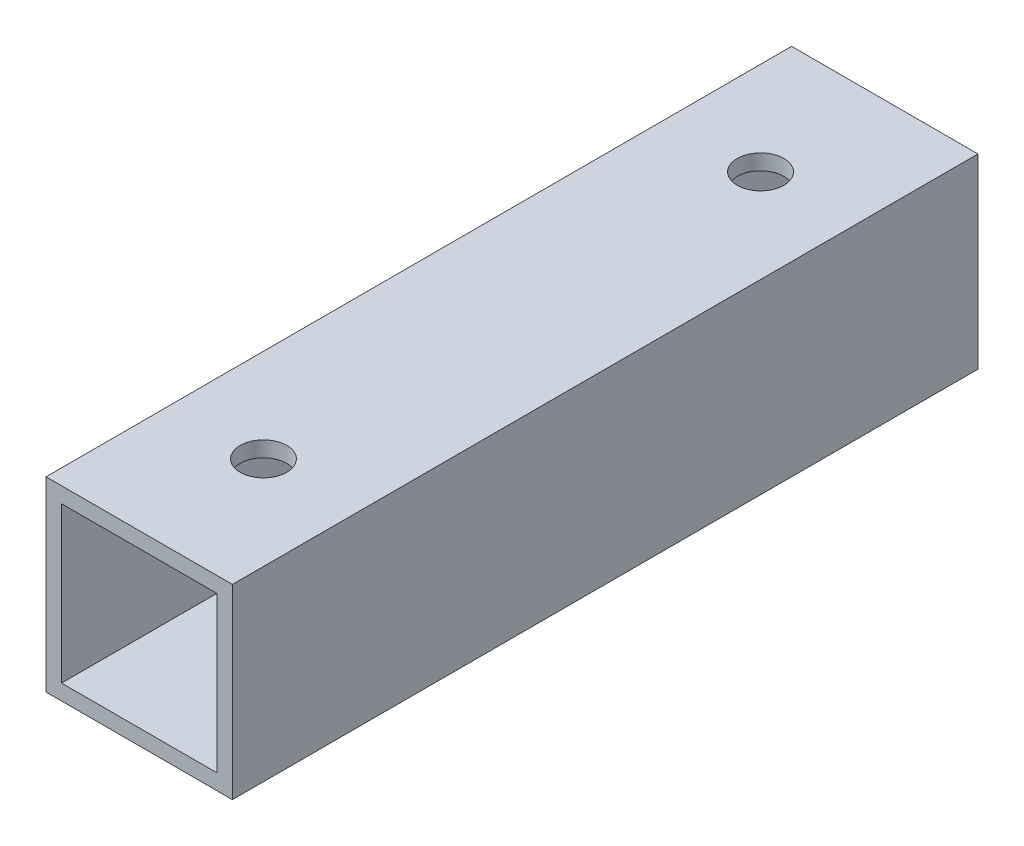
ISO-10303-21;
HEADER;
FILE_DESCRIPTION(('STEP AP214'),'2;1');
FILE_NAME('part.step','',(''),(''),'','','');
FILE_SCHEMA(('AUTOMOTIVE_DESIGN { 1 0 10303 214 1 1 1 1 }'));
ENDSEC;
DATA;
#1=APPLICATION_CONTEXT('core data for automotive mechanical design processes');
#2=APPLICATION_PROTOCOL_DEFINITION('international standard','automotive_design',2000,#1);
#3=PRODUCT_CONTEXT('',#1,'mechanical');
#4=PRODUCT('Part','Part','',(#3));
#5=PRODUCT_RELATED_PRODUCT_CATEGORY('part','',(#4));
#6=PRODUCT_DEFINITION_FORMATION('','',#4);
#7=PRODUCT_DEFINITION_CONTEXT('part definition',#1,'design');
#8=PRODUCT_DEFINITION('design','',#6,#7);
#9=PRODUCT_DEFINITION_SHAPE('','',#8);
#10=(LENGTH_UNIT() NAMED_UNIT(*) SI_UNIT(.MILLI.,.METRE.));
#11=(NAMED_UNIT(*) PLANE_ANGLE_UNIT() SI_UNIT($,.RADIAN.));
#12=(NAMED_UNIT(*) SI_UNIT($,.STERADIAN.) SOLID_ANGLE_UNIT());
#13=UNCERTAINTY_MEASURE_WITH_UNIT(LENGTH_MEASURE(1.E-05),#10,'distance_accuracy_value','');
#14=(GEOMETRIC_REPRESENTATION_CONTEXT(3) GLOBAL_UNCERTAINTY_ASSIGNED_CONTEXT((#13)) GLOBAL_UNIT_ASSIGNED_CONTEXT((#10,
#11,#12)) REPRESENTATION_CONTEXT('',''));
#15=CARTESIAN_POINT('',(0.,0.,0.));
#16=DIRECTION('',(0.,0.,1.));
#17=DIRECTION('',(1.,0.,0.));
#18=AXIS2_PLACEMENT_3D('',#15,#16,#17);
#19=CARTESIAN_POINT('',(0.,0.,76.2));
#20=DIRECTION('',(0.,0.,-1.));
#21=DIRECTION('',(-1.,0.,0.));
#22=AXIS2_PLACEMENT_3D('',#19,#20,#21);
#23=PLANE('',#22);
#24=DIRECTION('',(0.,1.,0.));
#25=VECTOR('',#24,1.);
#26=CARTESIAN_POINT('',(9.525,-9.525,76.2));
#27=LINE('',#26,#25);
#28=CARTESIAN_POINT('',(9.525,-9.525,76.2));
#29=VERTEX_POINT('',#28);
#30=CARTESIAN_POINT('',(9.525,9.525,76.2));
#31=VERTEX_POINT('',#30);
#32=EDGE_CURVE('E138',#29,#31,#27,.T.);
#33=ORIENTED_EDGE('',*,*,#32,.T.);
#34=DIRECTION('',(-1.,0.,0.));
#35=VECTOR('',#34,1.);
#36=CARTESIAN_POINT('',(-9.525,9.525,76.2));
#37=LINE('',#36,#35);
#38=CARTESIAN_POINT('',(-9.525,9.525,76.2));
#39=VERTEX_POINT('',#38);
#40=EDGE_CURVE('E141',#31,#39,#37,.T.);
#41=ORIENTED_EDGE('',*,*,#40,.T.);
#42=DIRECTION('',(0.,-1.,0.));
#43=VECTOR('',#42,1.);
#44=CARTESIAN_POINT('',(-9.525,-9.525,76.2));
#45=LINE('',#44,#43);
#46=CARTESIAN_POINT('',(-9.525,-9.525,76.2));
#47=VERTEX_POINT('',#46);
#48=EDGE_CURVE('E144',#39,#47,#45,.T.);
#49=ORIENTED_EDGE('',*,*,#48,.T.);
#50=DIRECTION('',(1.,0.,0.));
#51=VECTOR('',#50,1.);
#52=CARTESIAN_POINT('',(-9.525,-9.525,76.2));
#53=LINE('',#52,#51);
#54=EDGE_CURVE('E146',#47,#29,#53,.T.);
#55=ORIENTED_EDGE('',*,*,#54,.T.);
#56=EDGE_LOOP('',(#33,#41,#49,#55));
#57=FACE_BOUND('',#56,.T.);
#58=DIRECTION('',(0.,1.,0.));
#59=VECTOR('',#58,1.);
#60=CARTESIAN_POINT('',(7.9375,-7.9375,76.2));
#61=LINE('',#60,#59);
#62=CARTESIAN_POINT('',(7.9375,-7.9375,76.2));
#63=VERTEX_POINT('',#62);
#64=CARTESIAN_POINT('',(7.9375,7.9375,76.2));
#65=VERTEX_POINT('',#64);
#66=EDGE_CURVE('E100',#63,#65,#61,.T.);
#67=ORIENTED_EDGE('',*,*,#66,.F.);
#68=DIRECTION('',(1.,0.,0.));
#69=VECTOR('',#68,1.);
#70=CARTESIAN_POINT('',(-7.9375,-7.9375,76.2));
#71=LINE('',#70,#69);
#72=CARTESIAN_POINT('',(-7.9375,-7.9375,76.2));
#73=VERTEX_POINT('',#72);
#74=EDGE_CURVE('E122',#73,#63,#71,.T.);
#75=ORIENTED_EDGE('',*,*,#74,.F.);
#76=DIRECTION('',(0.,-1.,0.));
#77=VECTOR('',#76,1.);
#78=CARTESIAN_POINT('',(-7.9375,-7.9375,76.2));
#79=LINE('',#78,#77);
#80=CARTESIAN_POINT('',(-7.9375,7.9375,76.2));
#81=VERTEX_POINT('',#80);
#82=EDGE_CURVE('E120',#81,#73,#79,.T.);
#83=ORIENTED_EDGE('',*,*,#82,.F.);
#84=DIRECTION('',(-1.,0.,0.));
#85=VECTOR('',#84,1.);
#86=CARTESIAN_POINT('',(-7.9375,7.9375,76.2));
#87=LINE('',#86,#85);
#88=EDGE_CURVE('E108',#65,#81,#87,.T.);
#89=ORIENTED_EDGE('',*,*,#88,.F.);
#90=EDGE_LOOP('',(#67,#75,#83,#89));
#91=FACE_BOUND('',#90,.T.);
#92=ADVANCED_FACE('F33',(#57,#91),#23,.F.);
#93=CARTESIAN_POINT('',(0.,0.,0.));
#94=DIRECTION('',(0.,0.,-1.));
#95=DIRECTION('',(-1.,0.,0.));
#96=AXIS2_PLACEMENT_3D('',#93,#94,#95);
#97=PLANE('',#96);
#98=DIRECTION('',(0.,1.,0.));
#99=VECTOR('',#98,1.);
#100=CARTESIAN_POINT('',(9.525,-9.525,0.));
#101=LINE('',#100,#99);
#102=CARTESIAN_POINT('',(9.525,-9.525,0.));
#103=VERTEX_POINT('',#102);
#104=CARTESIAN_POINT('',(9.525,9.525,0.));
#105=VERTEX_POINT('',#104);
#106=EDGE_CURVE('E116',#103,#105,#101,.T.);
#107=ORIENTED_EDGE('',*,*,#106,.F.);
#108=DIRECTION('',(1.,0.,0.));
#109=VECTOR('',#108,1.);
#110=CARTESIAN_POINT('',(-9.525,-9.525,0.));
#111=LINE('',#110,#109);
#112=CARTESIAN_POINT('',(-9.525,-9.525,0.));
#113=VERTEX_POINT('',#112);
#114=EDGE_CURVE('E142',#113,#103,#111,.T.);
#115=ORIENTED_EDGE('',*,*,#114,.F.);
#116=DIRECTION('',(0.,-1.,0.));
#117=VECTOR('',#116,1.);
#118=CARTESIAN_POINT('',(-9.525,-9.525,0.));
#119=LINE('',#118,#117);
#120=CARTESIAN_POINT('',(-9.525,9.525,0.));
#121=VERTEX_POINT('',#120);
#122=EDGE_CURVE('E153',#121,#113,#119,.T.);
#123=ORIENTED_EDGE('',*,*,#122,.F.);
#124=DIRECTION('',(-1.,0.,0.));
#125=VECTOR('',#124,1.);
#126=CARTESIAN_POINT('',(-9.525,9.525,0.));
#127=LINE('',#126,#125);
#128=EDGE_CURVE('E151',#105,#121,#127,.T.);
#129=ORIENTED_EDGE('',*,*,#128,.F.);
#130=EDGE_LOOP('',(#107,#115,#123,#129));
#131=FACE_BOUND('',#130,.T.);
#132=DIRECTION('',(1.,0.,0.));
#133=VECTOR('',#132,1.);
#134=CARTESIAN_POINT('',(-7.9375,-7.9375,0.));
#135=LINE('',#134,#133);
#136=CARTESIAN_POINT('',(-7.9375,-7.9375,0.));
#137=VERTEX_POINT('',#136);
#138=CARTESIAN_POINT('',(7.9375,-7.9375,0.));
#139=VERTEX_POINT('',#138);
#140=EDGE_CURVE('E109',#137,#139,#135,.T.);
#141=ORIENTED_EDGE('',*,*,#140,.T.);
#142=DIRECTION('',(0.,1.,0.));
#143=VECTOR('',#142,1.);
#144=CARTESIAN_POINT('',(7.9375,-7.9375,0.));
#145=LINE('',#144,#143);
#146=CARTESIAN_POINT('',(7.9375,7.9375,0.));
#147=VERTEX_POINT('',#146);
#148=EDGE_CURVE('E58',#139,#147,#145,.T.);
#149=ORIENTED_EDGE('',*,*,#148,.T.);
#150=DIRECTION('',(-1.,0.,0.));
#151=VECTOR('',#150,1.);
#152=CARTESIAN_POINT('',(-7.9375,7.9375,0.));
#153=LINE('',#152,#151);
#154=CARTESIAN_POINT('',(-7.9375,7.9375,0.));
#155=VERTEX_POINT('',#154);
#156=EDGE_CURVE('E115',#147,#155,#153,.T.);
#157=ORIENTED_EDGE('',*,*,#156,.T.);
#158=DIRECTION('',(0.,-1.,0.));
#159=VECTOR('',#158,1.);
#160=CARTESIAN_POINT('',(-7.9375,-7.9375,0.));
#161=LINE('',#160,#159);
#162=EDGE_CURVE('E130',#155,#137,#161,.T.);
#163=ORIENTED_EDGE('',*,*,#162,.T.);
#164=EDGE_LOOP('',(#141,#149,#157,#163));
#165=FACE_BOUND('',#164,.T.);
#166=ADVANCED_FACE('F202',(#131,#165),#97,.T.);
#167=CARTESIAN_POINT('',(9.525,-9.525,76.2));
#168=DIRECTION('',(-1.,0.,0.));
#169=DIRECTION('',(0.,0.,1.));
#170=AXIS2_PLACEMENT_3D('',#167,#168,#169);
#171=PLANE('',#170);
#172=ORIENTED_EDGE('',*,*,#106,.T.);
#173=DIRECTION('',(0.,0.,-1.));
#174=VECTOR('',#173,1.);
#175=CARTESIAN_POINT('',(9.525,9.525,76.2));
#176=LINE('',#175,#174);
#177=EDGE_CURVE('E11',#31,#105,#176,.T.);
#178=ORIENTED_EDGE('',*,*,#177,.F.);
#179=ORIENTED_EDGE('',*,*,#32,.F.);
#180=DIRECTION('',(0.,0.,-1.));
#181=VECTOR('',#180,1.);
#182=CARTESIAN_POINT('',(9.525,-9.525,76.2));
#183=LINE('',#182,#181);
#184=EDGE_CURVE('E148',#29,#103,#183,.T.);
#185=ORIENTED_EDGE('',*,*,#184,.T.);
#186=EDGE_LOOP('',(#172,#178,#179,#185));
#187=FACE_BOUND('',#186,.T.);
#188=ADVANCED_FACE('F35',(#187),#171,.F.);
#189=CARTESIAN_POINT('',(-9.525,9.525,76.2));
#190=DIRECTION('',(0.,-1.,0.));
#191=DIRECTION('',(0.,0.,-1.));
#192=AXIS2_PLACEMENT_3D('',#189,#190,#191);
#193=PLANE('',#192);
#194=CARTESIAN_POINT('',(0.,9.525,12.7));
#195=DIRECTION('',(0.,1.,0.));
#196=DIRECTION('',(0.,0.,1.));
#197=AXIS2_PLACEMENT_3D('',#194,#195,#196);
#198=CIRCLE('',#197,2.38125);
#199=CARTESIAN_POINT('',(0.,9.525,15.08125));
#200=VERTEX_POINT('',#199);
#201=EDGE_CURVE('E171',#200,#200,#198,.T.);
#202=ORIENTED_EDGE('',*,*,#201,.F.);
#203=EDGE_LOOP('',(#202));
#204=FACE_BOUND('',#203,.T.);
#205=CARTESIAN_POINT('',(0.,9.525,63.5));
#206=DIRECTION('',(0.,1.,0.));
#207=DIRECTION('',(0.,0.,1.));
#208=AXIS2_PLACEMENT_3D('',#205,#206,#207);
#209=CIRCLE('',#208,2.38125);
#210=CARTESIAN_POINT('',(0.,9.525,65.88125));
#211=VERTEX_POINT('',#210);
#212=EDGE_CURVE('E180',#211,#211,#209,.T.);
#213=ORIENTED_EDGE('',*,*,#212,.F.);
#214=EDGE_LOOP('',(#213));
#215=FACE_BOUND('',#214,.T.);
#216=ORIENTED_EDGE('',*,*,#128,.T.);
#217=DIRECTION('',(0.,0.,-1.));
#218=VECTOR('',#217,1.);
#219=CARTESIAN_POINT('',(-9.525,9.525,76.2));
#220=LINE('',#219,#218);
#221=EDGE_CURVE('E42',#39,#121,#220,.T.);
#222=ORIENTED_EDGE('',*,*,#221,.F.);
#223=ORIENTED_EDGE('',*,*,#40,.F.);
#224=ORIENTED_EDGE('',*,*,#177,.T.);
#225=EDGE_LOOP('',(#216,#222,#223,#224));
#226=FACE_BOUND('',#225,.T.);
#227=ADVANCED_FACE('F228',(#204,#215,#226),#193,.F.);
#228=CARTESIAN_POINT('',(-9.525,-9.525,76.2));
#229=DIRECTION('',(1.,0.,0.));
#230=DIRECTION('',(0.,0.,-1.));
#231=AXIS2_PLACEMENT_3D('',#228,#229,#230);
#232=PLANE('',#231);
#233=CARTESIAN_POINT('',(-9.525,0.,38.1));
#234=DIRECTION('',(-1.,0.,0.));
#235=DIRECTION('',(0.,0.,1.));
#236=AXIS2_PLACEMENT_3D('',#233,#234,#235);
#237=CIRCLE('',#236,3.96875);
#238=CARTESIAN_POINT('',(-9.525,0.,42.06875));
#239=VERTEX_POINT('',#238);
#240=EDGE_CURVE('E183',#239,#239,#237,.T.);
#241=ORIENTED_EDGE('',*,*,#240,.F.);
#242=EDGE_LOOP('',(#241));
#243=FACE_BOUND('',#242,.T.);
#244=ORIENTED_EDGE('',*,*,#122,.T.);
#245=DIRECTION('',(0.,0.,-1.));
#246=VECTOR('',#245,1.);
#247=CARTESIAN_POINT('',(-9.525,-9.525,76.2));
#248=LINE('',#247,#246);
#249=EDGE_CURVE('E158',#47,#113,#248,.T.);
#250=ORIENTED_EDGE('',*,*,#249,.F.);
#251=ORIENTED_EDGE('',*,*,#48,.F.);
#252=ORIENTED_EDGE('',*,*,#221,.T.);
#253=EDGE_LOOP('',(#244,#250,#251,#252));
#254=FACE_BOUND('',#253,.T.);
#255=ADVANCED_FACE('F226',(#243,#254),#232,.F.);
#256=CARTESIAN_POINT('',(-9.525,-9.525,76.2));
#257=DIRECTION('',(0.,1.,0.));
#258=DIRECTION('',(0.,0.,1.));
#259=AXIS2_PLACEMENT_3D('',#256,#257,#258);
#260=PLANE('',#259);
#261=CARTESIAN_POINT('',(0.,-9.525,12.7));
#262=DIRECTION('',(0.,1.,0.));
#263=DIRECTION('',(0.,0.,1.));
#264=AXIS2_PLACEMENT_3D('',#261,#262,#263);
#265=CIRCLE('',#264,2.38125);
#266=CARTESIAN_POINT('',(0.,-9.525,15.08125));
#267=VERTEX_POINT('',#266);
#268=EDGE_CURVE('E165',#267,#267,#265,.T.);
#269=ORIENTED_EDGE('',*,*,#268,.T.);
#270=EDGE_LOOP('',(#269));
#271=FACE_BOUND('',#270,.T.);
#272=CARTESIAN_POINT('',(0.,-9.525,63.5));
#273=DIRECTION('',(0.,1.,0.));
#274=DIRECTION('',(0.,0.,1.));
#275=AXIS2_PLACEMENT_3D('',#272,#273,#274);
#276=CIRCLE('',#275,2.38125);
#277=CARTESIAN_POINT('',(0.,-9.525,65.88125));
#278=VERTEX_POINT('',#277);
#279=EDGE_CURVE('E176',#278,#278,#276,.T.);
#280=ORIENTED_EDGE('',*,*,#279,.T.);
#281=EDGE_LOOP('',(#280));
#282=FACE_BOUND('',#281,.T.);
#283=ORIENTED_EDGE('',*,*,#114,.T.);
#284=ORIENTED_EDGE('',*,*,#184,.F.);
#285=ORIENTED_EDGE('',*,*,#54,.F.);
#286=ORIENTED_EDGE('',*,*,#249,.T.);
#287=EDGE_LOOP('',(#283,#284,#285,#286));
#288=FACE_BOUND('',#287,.T.);
#289=ADVANCED_FACE('F223',(#271,#282,#288),#260,.F.);
#290=CARTESIAN_POINT('',(7.9375,-7.9375,76.2));
#291=DIRECTION('',(-1.,0.,0.));
#292=DIRECTION('',(0.,0.,1.));
#293=AXIS2_PLACEMENT_3D('',#290,#291,#292);
#294=PLANE('',#293);
#295=ORIENTED_EDGE('',*,*,#148,.F.);
#296=DIRECTION('',(0.,0.,-1.));
#297=VECTOR('',#296,1.);
#298=CARTESIAN_POINT('',(7.9375,-7.9375,76.2));
#299=LINE('',#298,#297);
#300=EDGE_CURVE('E104',#63,#139,#299,.T.);
#301=ORIENTED_EDGE('',*,*,#300,.F.);
#302=ORIENTED_EDGE('',*,*,#66,.T.);
#303=DIRECTION('',(0.,0.,-1.));
#304=VECTOR('',#303,1.);
#305=CARTESIAN_POINT('',(7.9375,7.9375,76.2));
#306=LINE('',#305,#304);
#307=EDGE_CURVE('E103',#65,#147,#306,.T.);
#308=ORIENTED_EDGE('',*,*,#307,.T.);
#309=EDGE_LOOP('',(#295,#301,#302,#308));
#310=FACE_BOUND('',#309,.T.);
#311=ADVANCED_FACE('F102',(#310),#294,.T.);
#312=CARTESIAN_POINT('',(-7.9375,7.9375,76.2));
#313=DIRECTION('',(0.,-1.,0.));
#314=DIRECTION('',(0.,0.,-1.));
#315=AXIS2_PLACEMENT_3D('',#312,#313,#314);
#316=PLANE('',#315);
#317=CARTESIAN_POINT('',(0.,7.93749999999999,12.7));
#318=DIRECTION('',(0.,-1.,0.));
#319=DIRECTION('',(0.,0.,-1.));
#320=AXIS2_PLACEMENT_3D('',#317,#318,#319);
#321=CIRCLE('',#320,2.38125);
#322=CARTESIAN_POINT('',(0.,7.93749999999999,15.08125));
#323=VERTEX_POINT('',#322);
#324=EDGE_CURVE('E128',#323,#323,#321,.T.);
#325=ORIENTED_EDGE('',*,*,#324,.F.);
#326=EDGE_LOOP('',(#325));
#327=FACE_BOUND('',#326,.T.);
#328=CARTESIAN_POINT('',(0.,7.93749999999999,63.5));
#329=DIRECTION('',(0.,-1.,0.));
#330=DIRECTION('',(0.,0.,-1.));
#331=AXIS2_PLACEMENT_3D('',#328,#329,#330);
#332=CIRCLE('',#331,2.38125);
#333=CARTESIAN_POINT('',(0.,7.93749999999999,65.88125));
#334=VERTEX_POINT('',#333);
#335=EDGE_CURVE('E164',#334,#334,#332,.T.);
#336=ORIENTED_EDGE('',*,*,#335,.F.);
#337=EDGE_LOOP('',(#336));
#338=FACE_BOUND('',#337,.T.);
#339=ORIENTED_EDGE('',*,*,#156,.F.);
#340=ORIENTED_EDGE('',*,*,#307,.F.);
#341=ORIENTED_EDGE('',*,*,#88,.T.);
#342=DIRECTION('',(0.,0.,-1.));
#343=VECTOR('',#342,1.);
#344=CARTESIAN_POINT('',(-7.9375,7.9375,76.2));
#345=LINE('',#344,#343);
#346=EDGE_CURVE('E117',#81,#155,#345,.T.);
#347=ORIENTED_EDGE('',*,*,#346,.T.);
#348=EDGE_LOOP('',(#339,#340,#341,#347));
#349=FACE_BOUND('',#348,.T.);
#350=ADVANCED_FACE('F112',(#327,#338,#349),#316,.T.);
#351=CARTESIAN_POINT('',(-7.9375,-7.9375,76.2));
#352=DIRECTION('',(1.,0.,0.));
#353=DIRECTION('',(0.,0.,-1.));
#354=AXIS2_PLACEMENT_3D('',#351,#352,#353);
#355=PLANE('',#354);
#356=CARTESIAN_POINT('',(-7.9375,0.,38.1));
#357=DIRECTION('',(1.,0.,0.));
#358=DIRECTION('',(0.,0.,-1.));
#359=AXIS2_PLACEMENT_3D('',#356,#357,#358);
#360=CIRCLE('',#359,3.96875);
#361=CARTESIAN_POINT('',(-7.9375,0.,34.13125));
#362=VERTEX_POINT('',#361);
#363=EDGE_CURVE('E315',#362,#362,#360,.F.);
#364=ORIENTED_EDGE('',*,*,#363,.T.);
#365=EDGE_LOOP('',(#364));
#366=FACE_BOUND('',#365,.T.);
#367=ORIENTED_EDGE('',*,*,#162,.F.);
#368=ORIENTED_EDGE('',*,*,#346,.F.);
#369=ORIENTED_EDGE('',*,*,#82,.T.);
#370=DIRECTION('',(0.,0.,-1.));
#371=VECTOR('',#370,1.);
#372=CARTESIAN_POINT('',(-7.9375,-7.9375,76.2));
#373=LINE('',#372,#371);
#374=EDGE_CURVE('E50',#73,#137,#373,.T.);
#375=ORIENTED_EDGE('',*,*,#374,.T.);
#376=EDGE_LOOP('',(#367,#368,#369,#375));
#377=FACE_BOUND('',#376,.T.);
#378=ADVANCED_FACE('F198',(#366,#377),#355,.T.);
#379=CARTESIAN_POINT('',(-7.9375,-7.9375,76.2));
#380=DIRECTION('',(0.,1.,0.));
#381=DIRECTION('',(0.,0.,1.));
#382=AXIS2_PLACEMENT_3D('',#379,#380,#381);
#383=PLANE('',#382);
#384=CARTESIAN_POINT('',(0.,-7.9375,12.7));
#385=DIRECTION('',(0.,1.,0.));
#386=DIRECTION('',(0.,0.,1.));
#387=AXIS2_PLACEMENT_3D('',#384,#385,#386);
#388=CIRCLE('',#387,2.38125);
#389=CARTESIAN_POINT('',(0.,-7.9375,15.08125));
#390=VERTEX_POINT('',#389);
#391=EDGE_CURVE('E37',#390,#390,#388,.T.);
#392=ORIENTED_EDGE('',*,*,#391,.F.);
#393=EDGE_LOOP('',(#392));
#394=FACE_BOUND('',#393,.T.);
#395=CARTESIAN_POINT('',(0.,-7.9375,63.5));
#396=DIRECTION('',(0.,1.,0.));
#397=DIRECTION('',(0.,0.,1.));
#398=AXIS2_PLACEMENT_3D('',#395,#396,#397);
#399=CIRCLE('',#398,2.38125);
#400=CARTESIAN_POINT('',(0.,-7.9375,65.88125));
#401=VERTEX_POINT('',#400);
#402=EDGE_CURVE('E162',#401,#401,#399,.T.);
#403=ORIENTED_EDGE('',*,*,#402,.F.);
#404=EDGE_LOOP('',(#403));
#405=FACE_BOUND('',#404,.T.);
#406=ORIENTED_EDGE('',*,*,#140,.F.);
#407=ORIENTED_EDGE('',*,*,#374,.F.);
#408=ORIENTED_EDGE('',*,*,#74,.T.);
#409=ORIENTED_EDGE('',*,*,#300,.T.);
#410=EDGE_LOOP('',(#406,#407,#408,#409));
#411=FACE_BOUND('',#410,.T.);
#412=ADVANCED_FACE('F194',(#394,#405,#411),#383,.T.);
#413=CARTESIAN_POINT('',(0.,-9.525,63.5));
#414=DIRECTION('',(0.,1.,0.));
#415=DIRECTION('',(0.,0.,1.));
#416=AXIS2_PLACEMENT_3D('',#413,#414,#415);
#417=CYLINDRICAL_SURFACE('',#416,2.38125);
#418=CARTESIAN_POINT('',(0.,-7.9375,65.88125));
#419=CARTESIAN_POINT('',(0.,-7.95403645833333,65.88125));
#420=CARTESIAN_POINT('',(0.,-7.97057291666667,65.88125));
#421=CARTESIAN_POINT('',(0.,-8.00364583333333,65.88125));
#422=CARTESIAN_POINT('',(0.,-8.02018229166667,65.88125));
#423=CARTESIAN_POINT('',(0.,-8.05325520833333,65.88125));
#424=CARTESIAN_POINT('',(0.,-8.06979166666667,65.88125));
#425=CARTESIAN_POINT('',(0.,-8.10286458333333,65.88125));
#426=CARTESIAN_POINT('',(0.,-8.11940104166667,65.88125));
#427=CARTESIAN_POINT('',(0.,-8.15247395833333,65.88125));
#428=CARTESIAN_POINT('',(0.,-8.16901041666667,65.88125));
#429=CARTESIAN_POINT('',(0.,-8.20208333333333,65.88125));
#430=CARTESIAN_POINT('',(0.,-8.21861979166667,65.88125));
#431=CARTESIAN_POINT('',(0.,-8.25169270833333,65.88125));
#432=CARTESIAN_POINT('',(0.,-8.26822916666667,65.88125));
#433=CARTESIAN_POINT('',(0.,-8.30130208333333,65.88125));
#434=CARTESIAN_POINT('',(0.,-8.31783854166667,65.88125));
#435=CARTESIAN_POINT('',(0.,-8.35091145833333,65.88125));
#436=CARTESIAN_POINT('',(0.,-8.36744791666667,65.88125));
#437=CARTESIAN_POINT('',(0.,-8.40052083333333,65.88125));
#438=CARTESIAN_POINT('',(0.,-8.41705729166667,65.88125));
#439=CARTESIAN_POINT('',(0.,-8.45013020833333,65.88125));
#440=CARTESIAN_POINT('',(0.,-8.46666666666667,65.88125));
#441=CARTESIAN_POINT('',(0.,-8.49973958333333,65.88125));
#442=CARTESIAN_POINT('',(0.,-8.51627604166667,65.88125));
#443=CARTESIAN_POINT('',(0.,-8.54934895833333,65.88125));
#444=CARTESIAN_POINT('',(0.,-8.56588541666667,65.88125));
#445=CARTESIAN_POINT('',(0.,-8.59895833333333,65.88125));
#446=CARTESIAN_POINT('',(0.,-8.61549479166667,65.88125));
#447=CARTESIAN_POINT('',(0.,-8.64856770833333,65.88125));
#448=CARTESIAN_POINT('',(0.,-8.66510416666667,65.88125));
#449=CARTESIAN_POINT('',(0.,-8.69817708333333,65.88125));
#450=CARTESIAN_POINT('',(0.,-8.71471354166667,65.88125));
#451=CARTESIAN_POINT('',(0.,-8.74778645833333,65.88125));
#452=CARTESIAN_POINT('',(0.,-8.76432291666667,65.88125));
#453=CARTESIAN_POINT('',(0.,-8.79739583333333,65.88125));
#454=CARTESIAN_POINT('',(0.,-8.81393229166667,65.88125));
#455=CARTESIAN_POINT('',(0.,-8.84700520833333,65.88125));
#456=CARTESIAN_POINT('',(0.,-8.86354166666667,65.88125));
#457=CARTESIAN_POINT('',(0.,-8.89661458333333,65.88125));
#458=CARTESIAN_POINT('',(0.,-8.91315104166667,65.88125));
#459=CARTESIAN_POINT('',(0.,-8.94622395833333,65.88125));
#460=CARTESIAN_POINT('',(0.,-8.96276041666667,65.88125));
#461=CARTESIAN_POINT('',(0.,-8.99583333333334,65.88125));
#462=CARTESIAN_POINT('',(0.,-9.01236979166667,65.88125));
#463=CARTESIAN_POINT('',(0.,-9.04544270833333,65.88125));
#464=CARTESIAN_POINT('',(0.,-9.06197916666667,65.88125));
#465=CARTESIAN_POINT('',(0.,-9.09505208333333,65.88125));
#466=CARTESIAN_POINT('',(0.,-9.11158854166667,65.88125));
#467=CARTESIAN_POINT('',(0.,-9.14466145833333,65.88125));
#468=CARTESIAN_POINT('',(0.,-9.16119791666667,65.88125));
#469=CARTESIAN_POINT('',(0.,-9.19427083333333,65.88125));
#470=CARTESIAN_POINT('',(0.,-9.21080729166667,65.88125));
#471=CARTESIAN_POINT('',(0.,-9.24388020833333,65.88125));
#472=CARTESIAN_POINT('',(0.,-9.26041666666667,65.88125));
#473=CARTESIAN_POINT('',(0.,-9.29348958333333,65.88125));
#474=CARTESIAN_POINT('',(0.,-9.31002604166667,65.88125));
#475=CARTESIAN_POINT('',(0.,-9.34309895833333,65.88125));
#476=CARTESIAN_POINT('',(0.,-9.35963541666667,65.88125));
#477=CARTESIAN_POINT('',(0.,-9.39270833333333,65.88125));
#478=CARTESIAN_POINT('',(0.,-9.40924479166667,65.88125));
#479=CARTESIAN_POINT('',(0.,-9.44231770833333,65.88125));
#480=CARTESIAN_POINT('',(0.,-9.45885416666667,65.88125));
#481=CARTESIAN_POINT('',(0.,-9.49192708333333,65.88125));
#482=CARTESIAN_POINT('',(0.,-9.50846354166667,65.88125));
#483=CARTESIAN_POINT('',(0.,-9.525,65.88125));
#484=B_SPLINE_CURVE_WITH_KNOTS('',3,(#418,#419,#420,#421,#422,#423,#424,#425,#426,#427,#428,
#429,#430,#431,#432,#433,#434,#435,#436,#437,#438,#439,#440,#441,#442,#443,#444,#445,#446,#447,
#448,#449,#450,#451,#452,#453,#454,#455,#456,#457,#458,#459,#460,#461,#462,#463,#464,#465,#466,
#467,#468,#469,#470,#471,#472,#473,#474,#475,#476,#477,#478,#479,#480,#481,#482,#483),
.UNSPECIFIED.,.F.,.F.,(4,2,2,2,2,2,2,2,2,2,2,2,2,2,2,2,2,2,2,2,2,2,2,2,2,2,2,2,2,2,2,2,4),(0.,
0.0496093750000006,0.0992187500000012,0.148828125000002,0.198437500000001,0.248046875000001,
0.297656250000002,0.347265625000001,0.396875000000001,0.446484375000002,0.496093750000001,
0.545703125000002,0.595312500000002,0.644921875000001,0.694531250000002,0.744140625000002,
0.793750000000001,0.843359375000002,0.892968750000002,0.942578125000001,0.992187500000002,
1.041796875,1.09140625,1.141015625,1.190625,1.240234375,1.28984375,1.339453125,1.3890625,
1.438671875,1.48828125,1.537890625,1.5875),.UNSPECIFIED.);
#485=EDGE_CURVE('BSEAM197',#401,#278,#484,.T.);
#486=ORIENTED_EDGE('',*,*,#402,.T.);
#487=ORIENTED_EDGE('',*,*,#279,.F.);
#488=ORIENTED_EDGE('',*,*,#485,.T.);
#489=ORIENTED_EDGE('',*,*,#485,.F.);
#490=EDGE_LOOP('',(#486,#488,#487,#489));
#491=FACE_BOUND('',#490,.T.);
#492=ADVANCED_FACE('F197',(#491),#417,.F.);
#493=CARTESIAN_POINT('',(0.,-9.525,12.7));
#494=DIRECTION('',(0.,1.,0.));
#495=DIRECTION('',(0.,0.,1.));
#496=AXIS2_PLACEMENT_3D('',#493,#494,#495);
#497=CYLINDRICAL_SURFACE('',#496,2.38125);
#498=CARTESIAN_POINT('',(0.,-7.9375,15.08125));
#499=CARTESIAN_POINT('',(0.,-7.95403645833333,15.08125));
#500=CARTESIAN_POINT('',(0.,-7.97057291666667,15.08125));
#501=CARTESIAN_POINT('',(0.,-8.00364583333333,15.08125));
#502=CARTESIAN_POINT('',(0.,-8.02018229166667,15.08125));
#503=CARTESIAN_POINT('',(0.,-8.05325520833333,15.08125));
#504=CARTESIAN_POINT('',(0.,-8.06979166666667,15.08125));
#505=CARTESIAN_POINT('',(0.,-8.10286458333333,15.08125));
#506=CARTESIAN_POINT('',(0.,-8.11940104166667,15.08125));
#507=CARTESIAN_POINT('',(0.,-8.15247395833333,15.08125));
#508=CARTESIAN_POINT('',(0.,-8.16901041666667,15.08125));
#509=CARTESIAN_POINT('',(0.,-8.20208333333333,15.08125));
#510=CARTESIAN_POINT('',(0.,-8.21861979166667,15.08125));
#511=CARTESIAN_POINT('',(0.,-8.25169270833333,15.08125));
#512=CARTESIAN_POINT('',(0.,-8.26822916666667,15.08125));
#513=CARTESIAN_POINT('',(0.,-8.30130208333333,15.08125));
#514=CARTESIAN_POINT('',(0.,-8.31783854166667,15.08125));
#515=CARTESIAN_POINT('',(0.,-8.35091145833333,15.08125));
#516=CARTESIAN_POINT('',(0.,-8.36744791666667,15.08125));
#517=CARTESIAN_POINT('',(0.,-8.40052083333333,15.08125));
#518=CARTESIAN_POINT('',(0.,-8.41705729166667,15.08125));
#519=CARTESIAN_POINT('',(0.,-8.45013020833333,15.08125));
#520=CARTESIAN_POINT('',(0.,-8.46666666666667,15.08125));
#521=CARTESIAN_POINT('',(0.,-8.49973958333333,15.08125));
#522=CARTESIAN_POINT('',(0.,-8.51627604166667,15.08125));
#523=CARTESIAN_POINT('',(0.,-8.54934895833333,15.08125));
#524=CARTESIAN_POINT('',(0.,-8.56588541666667,15.08125));
#525=CARTESIAN_POINT('',(0.,-8.59895833333333,15.08125));
#526=CARTESIAN_POINT('',(0.,-8.61549479166667,15.08125));
#527=CARTESIAN_POINT('',(0.,-8.64856770833333,15.08125));
#528=CARTESIAN_POINT('',(0.,-8.66510416666667,15.08125));
#529=CARTESIAN_POINT('',(0.,-8.69817708333333,15.08125));
#530=CARTESIAN_POINT('',(0.,-8.71471354166667,15.08125));
#531=CARTESIAN_POINT('',(0.,-8.74778645833333,15.08125));
#532=CARTESIAN_POINT('',(0.,-8.76432291666667,15.08125));
#533=CARTESIAN_POINT('',(0.,-8.79739583333333,15.08125));
#534=CARTESIAN_POINT('',(0.,-8.81393229166667,15.08125));
#535=CARTESIAN_POINT('',(0.,-8.84700520833333,15.08125));
#536=CARTESIAN_POINT('',(0.,-8.86354166666667,15.08125));
#537=CARTESIAN_POINT('',(0.,-8.89661458333333,15.08125));
#538=CARTESIAN_POINT('',(0.,-8.91315104166667,15.08125));
#539=CARTESIAN_POINT('',(0.,-8.94622395833333,15.08125));
#540=CARTESIAN_POINT('',(0.,-8.96276041666667,15.08125));
#541=CARTESIAN_POINT('',(0.,-8.99583333333334,15.08125));
#542=CARTESIAN_POINT('',(0.,-9.01236979166667,15.08125));
#543=CARTESIAN_POINT('',(0.,-9.04544270833333,15.08125));
#544=CARTESIAN_POINT('',(0.,-9.06197916666667,15.08125));
#545=CARTESIAN_POINT('',(0.,-9.09505208333333,15.08125));
#546=CARTESIAN_POINT('',(0.,-9.11158854166667,15.08125));
#547=CARTESIAN_POINT('',(0.,-9.14466145833333,15.08125));
#548=CARTESIAN_POINT('',(0.,-9.16119791666667,15.08125));
#549=CARTESIAN_POINT('',(0.,-9.19427083333333,15.08125));
#550=CARTESIAN_POINT('',(0.,-9.21080729166667,15.08125));
#551=CARTESIAN_POINT('',(0.,-9.24388020833333,15.08125));
#552=CARTESIAN_POINT('',(0.,-9.26041666666667,15.08125));
#553=CARTESIAN_POINT('',(0.,-9.29348958333333,15.08125));
#554=CARTESIAN_POINT('',(0.,-9.31002604166667,15.08125));
#555=CARTESIAN_POINT('',(0.,-9.34309895833333,15.08125));
#556=CARTESIAN_POINT('',(0.,-9.35963541666667,15.08125));
#557=CARTESIAN_POINT('',(0.,-9.39270833333333,15.08125));
#558=CARTESIAN_POINT('',(0.,-9.40924479166667,15.08125));
#559=CARTESIAN_POINT('',(0.,-9.44231770833333,15.08125));
#560=CARTESIAN_POINT('',(0.,-9.45885416666667,15.08125));
#561=CARTESIAN_POINT('',(0.,-9.49192708333333,15.08125));
#562=CARTESIAN_POINT('',(0.,-9.50846354166667,15.08125));
#563=CARTESIAN_POINT('',(0.,-9.525,15.08125));
#564=B_SPLINE_CURVE_WITH_KNOTS('',3,(#498,#499,#500,#501,#502,#503,#504,#505,#506,#507,#508,
#509,#510,#511,#512,#513,#514,#515,#516,#517,#518,#519,#520,#521,#522,#523,#524,#525,#526,#527,
#528,#529,#530,#531,#532,#533,#534,#535,#536,#537,#538,#539,#540,#541,#542,#543,#544,#545,#546,
#547,#548,#549,#550,#551,#552,#553,#554,#555,#556,#557,#558,#559,#560,#561,#562,#563),
.UNSPECIFIED.,.F.,.F.,(4,2,2,2,2,2,2,2,2,2,2,2,2,2,2,2,2,2,2,2,2,2,2,2,2,2,2,2,2,2,2,2,4),(0.,
0.0496093750000006,0.0992187500000012,0.148828125000002,0.198437500000001,0.248046875000001,
0.297656250000002,0.347265625000001,0.396875000000001,0.446484375000002,0.496093750000001,
0.545703125000002,0.595312500000002,0.644921875000001,0.694531250000002,0.744140625000002,
0.793750000000001,0.843359375000002,0.892968750000002,0.942578125000001,0.992187500000002,
1.041796875,1.09140625,1.141015625,1.190625,1.240234375,1.28984375,1.339453125,1.3890625,
1.438671875,1.48828125,1.537890625,1.5875),.UNSPECIFIED.);
#565=EDGE_CURVE('BSEAM191',#390,#267,#564,.T.);
#566=ORIENTED_EDGE('',*,*,#391,.T.);
#567=ORIENTED_EDGE('',*,*,#268,.F.);
#568=ORIENTED_EDGE('',*,*,#565,.T.);
#569=ORIENTED_EDGE('',*,*,#565,.F.);
#570=EDGE_LOOP('',(#566,#568,#567,#569));
#571=FACE_BOUND('',#570,.T.);
#572=ADVANCED_FACE('F191',(#571),#497,.F.);
#573=CARTESIAN_POINT('',(0.,7.93749999999999,65.88125));
#574=CARTESIAN_POINT('',(0.,7.95403645833333,65.88125));
#575=CARTESIAN_POINT('',(0.,7.97057291666666,65.88125));
#576=CARTESIAN_POINT('',(0.,8.00364583333333,65.88125));
#577=CARTESIAN_POINT('',(0.,8.02018229166666,65.88125));
#578=CARTESIAN_POINT('',(0.,8.05325520833333,65.88125));
#579=CARTESIAN_POINT('',(0.,8.06979166666666,65.88125));
#580=CARTESIAN_POINT('',(0.,8.10286458333333,65.88125));
#581=CARTESIAN_POINT('',(0.,8.11940104166666,65.88125));
#582=CARTESIAN_POINT('',(0.,8.15247395833333,65.88125));
#583=CARTESIAN_POINT('',(0.,8.16901041666666,65.88125));
#584=CARTESIAN_POINT('',(0.,8.20208333333333,65.88125));
#585=CARTESIAN_POINT('',(0.,8.21861979166666,65.88125));
#586=CARTESIAN_POINT('',(0.,8.25169270833333,65.88125));
#587=CARTESIAN_POINT('',(0.,8.26822916666666,65.88125));
#588=CARTESIAN_POINT('',(0.,8.30130208333333,65.88125));
#589=CARTESIAN_POINT('',(0.,8.31783854166666,65.88125));
#590=CARTESIAN_POINT('',(0.,8.35091145833333,65.88125));
#591=CARTESIAN_POINT('',(0.,8.36744791666666,65.88125));
#592=CARTESIAN_POINT('',(0.,8.40052083333333,65.88125));
#593=CARTESIAN_POINT('',(0.,8.41705729166666,65.88125));
#594=CARTESIAN_POINT('',(0.,8.45013020833333,65.88125));
#595=CARTESIAN_POINT('',(0.,8.46666666666666,65.88125));
#596=CARTESIAN_POINT('',(0.,8.49973958333333,65.88125));
#597=CARTESIAN_POINT('',(0.,8.51627604166666,65.88125));
#598=CARTESIAN_POINT('',(0.,8.54934895833333,65.88125));
#599=CARTESIAN_POINT('',(0.,8.56588541666666,65.88125));
#600=CARTESIAN_POINT('',(0.,8.59895833333333,65.88125));
#601=CARTESIAN_POINT('',(0.,8.61549479166666,65.88125));
#602=CARTESIAN_POINT('',(0.,8.64856770833333,65.88125));
#603=CARTESIAN_POINT('',(0.,8.66510416666666,65.88125));
#604=CARTESIAN_POINT('',(0.,8.69817708333333,65.88125));
#605=CARTESIAN_POINT('',(0.,8.71471354166667,65.88125));
#606=CARTESIAN_POINT('',(0.,8.74778645833333,65.88125));
#607=CARTESIAN_POINT('',(0.,8.76432291666666,65.88125));
#608=CARTESIAN_POINT('',(0.,8.79739583333333,65.88125));
#609=CARTESIAN_POINT('',(0.,8.81393229166667,65.88125));
#610=CARTESIAN_POINT('',(0.,8.84700520833333,65.88125));
#611=CARTESIAN_POINT('',(0.,8.86354166666666,65.88125));
#612=CARTESIAN_POINT('',(0.,8.89661458333333,65.88125));
#613=CARTESIAN_POINT('',(0.,8.91315104166667,65.88125));
#614=CARTESIAN_POINT('',(0.,8.94622395833333,65.88125));
#615=CARTESIAN_POINT('',(0.,8.96276041666667,65.88125));
#616=CARTESIAN_POINT('',(0.,8.99583333333333,65.88125));
#617=CARTESIAN_POINT('',(0.,9.01236979166667,65.88125));
#618=CARTESIAN_POINT('',(0.,9.04544270833333,65.88125));
#619=CARTESIAN_POINT('',(0.,9.06197916666667,65.88125));
#620=CARTESIAN_POINT('',(0.,9.09505208333333,65.88125));
#621=CARTESIAN_POINT('',(0.,9.11158854166667,65.88125));
#622=CARTESIAN_POINT('',(0.,9.14466145833333,65.88125));
#623=CARTESIAN_POINT('',(0.,9.16119791666667,65.88125));
#624=CARTESIAN_POINT('',(0.,9.19427083333333,65.88125));
#625=CARTESIAN_POINT('',(0.,9.21080729166667,65.88125));
#626=CARTESIAN_POINT('',(0.,9.24388020833333,65.88125));
#627=CARTESIAN_POINT('',(0.,9.26041666666667,65.88125));
#628=CARTESIAN_POINT('',(0.,9.29348958333333,65.88125));
#629=CARTESIAN_POINT('',(0.,9.31002604166667,65.88125));
#630=CARTESIAN_POINT('',(0.,9.34309895833333,65.88125));
#631=CARTESIAN_POINT('',(0.,9.35963541666667,65.88125));
#632=CARTESIAN_POINT('',(0.,9.39270833333333,65.88125));
#633=CARTESIAN_POINT('',(0.,9.40924479166667,65.88125));
#634=CARTESIAN_POINT('',(0.,9.44231770833333,65.88125));
#635=CARTESIAN_POINT('',(0.,9.45885416666667,65.88125));
#636=CARTESIAN_POINT('',(0.,9.49192708333333,65.88125));
#637=CARTESIAN_POINT('',(0.,9.50846354166667,65.88125));
#638=CARTESIAN_POINT('',(0.,9.525,65.88125));
#639=B_SPLINE_CURVE_WITH_KNOTS('',3,(#573,#574,#575,#576,#577,#578,#579,#580,#581,#582,#583,
#584,#585,#586,#587,#588,#589,#590,#591,#592,#593,#594,#595,#596,#597,#598,#599,#600,#601,#602,
#603,#604,#605,#606,#607,#608,#609,#610,#611,#612,#613,#614,#615,#616,#617,#618,#619,#620,#621,
#622,#623,#624,#625,#626,#627,#628,#629,#630,#631,#632,#633,#634,#635,#636,#637,#638),
.UNSPECIFIED.,.F.,.F.,(4,2,2,2,2,2,2,2,2,2,2,2,2,2,2,2,2,2,2,2,2,2,2,2,2,2,2,2,2,2,2,2,4),(0.,
0.0496093749999989,0.0992187500000012,0.148828125,0.198437500000002,0.248046875000001,
0.29765625,0.347265625000003,0.396875000000001,0.446484375,0.496093750000003,0.545703125000002,
0.5953125,0.644921875000003,0.694531250000002,0.744140625000004,0.793750000000003,
0.843359375000002,0.892968750000004,0.942578125000003,0.992187500000005,1.041796875,1.09140625,
1.14101562500001,1.190625,1.240234375,1.28984375000001,1.339453125,1.3890625,1.43867187500001,
1.48828125,1.53789062500001,1.58750000000001),.UNSPECIFIED.);
#640=EDGE_CURVE('BSEAM253',#334,#211,#639,.T.);
#641=ORIENTED_EDGE('',*,*,#335,.T.);
#642=ORIENTED_EDGE('',*,*,#212,.T.);
#643=ORIENTED_EDGE('',*,*,#640,.T.);
#644=ORIENTED_EDGE('',*,*,#640,.F.);
#645=EDGE_LOOP('',(#641,#643,#642,#644));
#646=FACE_BOUND('',#645,.T.);
#647=ADVANCED_FACE('F253',(#646),#417,.F.);
#648=CARTESIAN_POINT('',(0.,7.93749999999999,15.08125));
#649=CARTESIAN_POINT('',(0.,7.95403645833333,15.08125));
#650=CARTESIAN_POINT('',(0.,7.97057291666666,15.08125));
#651=CARTESIAN_POINT('',(0.,8.00364583333333,15.08125));
#652=CARTESIAN_POINT('',(0.,8.02018229166666,15.08125));
#653=CARTESIAN_POINT('',(0.,8.05325520833333,15.08125));
#654=CARTESIAN_POINT('',(0.,8.06979166666666,15.08125));
#655=CARTESIAN_POINT('',(0.,8.10286458333333,15.08125));
#656=CARTESIAN_POINT('',(0.,8.11940104166666,15.08125));
#657=CARTESIAN_POINT('',(0.,8.15247395833333,15.08125));
#658=CARTESIAN_POINT('',(0.,8.16901041666666,15.08125));
#659=CARTESIAN_POINT('',(0.,8.20208333333333,15.08125));
#660=CARTESIAN_POINT('',(0.,8.21861979166666,15.08125));
#661=CARTESIAN_POINT('',(0.,8.25169270833333,15.08125));
#662=CARTESIAN_POINT('',(0.,8.26822916666666,15.08125));
#663=CARTESIAN_POINT('',(0.,8.30130208333333,15.08125));
#664=CARTESIAN_POINT('',(0.,8.31783854166666,15.08125));
#665=CARTESIAN_POINT('',(0.,8.35091145833333,15.08125));
#666=CARTESIAN_POINT('',(0.,8.36744791666666,15.08125));
#667=CARTESIAN_POINT('',(0.,8.40052083333333,15.08125));
#668=CARTESIAN_POINT('',(0.,8.41705729166666,15.08125));
#669=CARTESIAN_POINT('',(0.,8.45013020833333,15.08125));
#670=CARTESIAN_POINT('',(0.,8.46666666666666,15.08125));
#671=CARTESIAN_POINT('',(0.,8.49973958333333,15.08125));
#672=CARTESIAN_POINT('',(0.,8.51627604166666,15.08125));
#673=CARTESIAN_POINT('',(0.,8.54934895833333,15.08125));
#674=CARTESIAN_POINT('',(0.,8.56588541666666,15.08125));
#675=CARTESIAN_POINT('',(0.,8.59895833333333,15.08125));
#676=CARTESIAN_POINT('',(0.,8.61549479166666,15.08125));
#677=CARTESIAN_POINT('',(0.,8.64856770833333,15.08125));
#678=CARTESIAN_POINT('',(0.,8.66510416666666,15.08125));
#679=CARTESIAN_POINT('',(0.,8.69817708333333,15.08125));
#680=CARTESIAN_POINT('',(0.,8.71471354166667,15.08125));
#681=CARTESIAN_POINT('',(0.,8.74778645833333,15.08125));
#682=CARTESIAN_POINT('',(0.,8.76432291666666,15.08125));
#683=CARTESIAN_POINT('',(0.,8.79739583333333,15.08125));
#684=CARTESIAN_POINT('',(0.,8.81393229166667,15.08125));
#685=CARTESIAN_POINT('',(0.,8.84700520833333,15.08125));
#686=CARTESIAN_POINT('',(0.,8.86354166666666,15.08125));
#687=CARTESIAN_POINT('',(0.,8.89661458333333,15.08125));
#688=CARTESIAN_POINT('',(0.,8.91315104166667,15.08125));
#689=CARTESIAN_POINT('',(0.,8.94622395833333,15.08125));
#690=CARTESIAN_POINT('',(0.,8.96276041666667,15.08125));
#691=CARTESIAN_POINT('',(0.,8.99583333333333,15.08125));
#692=CARTESIAN_POINT('',(0.,9.01236979166667,15.08125));
#693=CARTESIAN_POINT('',(0.,9.04544270833333,15.08125));
#694=CARTESIAN_POINT('',(0.,9.06197916666667,15.08125));
#695=CARTESIAN_POINT('',(0.,9.09505208333333,15.08125));
#696=CARTESIAN_POINT('',(0.,9.11158854166667,15.08125));
#697=CARTESIAN_POINT('',(0.,9.14466145833333,15.08125));
#698=CARTESIAN_POINT('',(0.,9.16119791666667,15.08125));
#699=CARTESIAN_POINT('',(0.,9.19427083333333,15.08125));
#700=CARTESIAN_POINT('',(0.,9.21080729166667,15.08125));
#701=CARTESIAN_POINT('',(0.,9.24388020833333,15.08125));
#702=CARTESIAN_POINT('',(0.,9.26041666666667,15.08125));
#703=CARTESIAN_POINT('',(0.,9.29348958333333,15.08125));
#704=CARTESIAN_POINT('',(0.,9.31002604166667,15.08125));
#705=CARTESIAN_POINT('',(0.,9.34309895833333,15.08125));
#706=CARTESIAN_POINT('',(0.,9.35963541666667,15.08125));
#707=CARTESIAN_POINT('',(0.,9.39270833333333,15.08125));
#708=CARTESIAN_POINT('',(0.,9.40924479166667,15.08125));
#709=CARTESIAN_POINT('',(0.,9.44231770833333,15.08125));
#710=CARTESIAN_POINT('',(0.,9.45885416666667,15.08125));
#711=CARTESIAN_POINT('',(0.,9.49192708333333,15.08125));
#712=CARTESIAN_POINT('',(0.,9.50846354166667,15.08125));
#713=CARTESIAN_POINT('',(0.,9.525,15.08125));
#714=B_SPLINE_CURVE_WITH_KNOTS('',3,(#648,#649,#650,#651,#652,#653,#654,#655,#656,#657,#658,
#659,#660,#661,#662,#663,#664,#665,#666,#667,#668,#669,#670,#671,#672,#673,#674,#675,#676,#677,
#678,#679,#680,#681,#682,#683,#684,#685,#686,#687,#688,#689,#690,#691,#692,#693,#694,#695,#696,
#697,#698,#699,#700,#701,#702,#703,#704,#705,#706,#707,#708,#709,#710,#711,#712,#713),
.UNSPECIFIED.,.F.,.F.,(4,2,2,2,2,2,2,2,2,2,2,2,2,2,2,2,2,2,2,2,2,2,2,2,2,2,2,2,2,2,2,2,4),(0.,
0.0496093749999989,0.0992187500000012,0.148828125,0.198437500000002,0.248046875000001,
0.29765625,0.347265625000003,0.396875000000001,0.446484375,0.496093750000003,0.545703125000002,
0.5953125,0.644921875000003,0.694531250000002,0.744140625000004,0.793750000000003,
0.843359375000002,0.892968750000004,0.942578125000003,0.992187500000005,1.041796875,1.09140625,
1.14101562500001,1.190625,1.240234375,1.28984375000001,1.339453125,1.3890625,1.43867187500001,
1.48828125,1.53789062500001,1.58750000000001),.UNSPECIFIED.);
#715=EDGE_CURVE('BSEAM255',#323,#200,#714,.T.);
#716=ORIENTED_EDGE('',*,*,#324,.T.);
#717=ORIENTED_EDGE('',*,*,#201,.T.);
#718=ORIENTED_EDGE('',*,*,#715,.T.);
#719=ORIENTED_EDGE('',*,*,#715,.F.);
#720=EDGE_LOOP('',(#716,#718,#717,#719));
#721=FACE_BOUND('',#720,.T.);
#722=ADVANCED_FACE('F255',(#721),#497,.F.);
#723=CARTESIAN_POINT('',(9.526,0.,38.1));
#724=DIRECTION('',(-1.,0.,0.));
#725=DIRECTION('',(0.,0.,1.));
#726=AXIS2_PLACEMENT_3D('',#723,#724,#725);
#727=CYLINDRICAL_SURFACE('',#726,3.96875);
#728=ORIENTED_EDGE('',*,*,#363,.F.);
#729=EDGE_LOOP('',(#728));
#730=FACE_BOUND('',#729,.T.);
#731=ORIENTED_EDGE('',*,*,#240,.T.);
#732=EDGE_LOOP('',(#731));
#733=FACE_BOUND('',#732,.T.);
#734=ADVANCED_FACE('F262',(#730,#733),#727,.F.);
#735=CLOSED_SHELL('',(#92,#166,#188,#227,#255,#289,#311,#350,#378,#412,#492,#572,#647,#722,#734));
#736=MANIFOLD_SOLID_BREP('B2',#735);
#737=ADVANCED_BREP_SHAPE_REPRESENTATION('',(#18,#736),#14);
#738=SHAPE_DEFINITION_REPRESENTATION(#9,#737);
ENDSEC;
END-ISO-10303-21;
